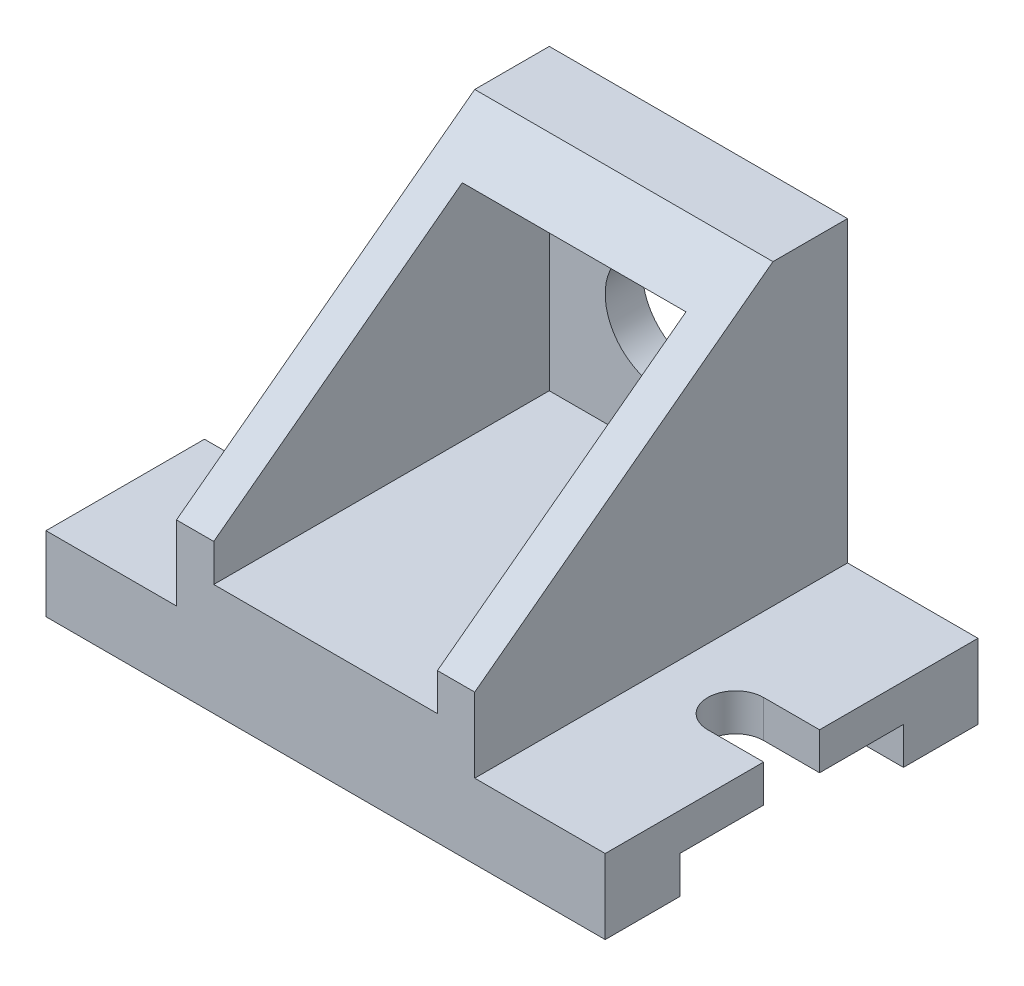
ISO-10303-21;
HEADER;
FILE_DESCRIPTION(('STEP AP214'),'2;1');
FILE_NAME('part.step','',(''),(''),'','','');
FILE_SCHEMA(('AUTOMOTIVE_DESIGN { 1 0 10303 214 1 1 1 1 }'));
ENDSEC;
DATA;
#1=APPLICATION_CONTEXT('core data for automotive mechanical design processes');
#2=APPLICATION_PROTOCOL_DEFINITION('international standard','automotive_design',2000,#1);
#3=PRODUCT_CONTEXT('',#1,'mechanical');
#4=PRODUCT('Part','Part','',(#3));
#5=PRODUCT_RELATED_PRODUCT_CATEGORY('part','',(#4));
#6=PRODUCT_DEFINITION_FORMATION('','',#4);
#7=PRODUCT_DEFINITION_CONTEXT('part definition',#1,'design');
#8=PRODUCT_DEFINITION('design','',#6,#7);
#9=PRODUCT_DEFINITION_SHAPE('','',#8);
#10=(LENGTH_UNIT() NAMED_UNIT(*) SI_UNIT(.MILLI.,.METRE.));
#11=(NAMED_UNIT(*) PLANE_ANGLE_UNIT() SI_UNIT($,.RADIAN.));
#12=(NAMED_UNIT(*) SI_UNIT($,.STERADIAN.) SOLID_ANGLE_UNIT());
#13=UNCERTAINTY_MEASURE_WITH_UNIT(LENGTH_MEASURE(1.E-05),#10,'distance_accuracy_value','');
#14=(GEOMETRIC_REPRESENTATION_CONTEXT(3) GLOBAL_UNCERTAINTY_ASSIGNED_CONTEXT((#13)) GLOBAL_UNIT_ASSIGNED_CONTEXT((#10,
#11,#12)) REPRESENTATION_CONTEXT('',''));
#15=CARTESIAN_POINT('',(0.,0.,0.));
#16=DIRECTION('',(0.,0.,1.));
#17=DIRECTION('',(1.,0.,0.));
#18=AXIS2_PLACEMENT_3D('',#15,#16,#17);
#19=CARTESIAN_POINT('',(150.,0.,0.));
#20=DIRECTION('',(1.,0.,0.));
#21=DIRECTION('',(0.,0.,-1.));
#22=AXIS2_PLACEMENT_3D('',#19,#20,#21);
#23=PLANE('',#22);
#24=DIRECTION('',(0.,1.,0.));
#25=VECTOR('',#24,1.);
#26=CARTESIAN_POINT('',(150.,0.,-7.49999999999997));
#27=LINE('',#26,#25);
#28=CARTESIAN_POINT('',(150.,0.,-7.49999999999997));
#29=VERTEX_POINT('',#28);
#30=CARTESIAN_POINT('',(150.,10.,-7.49999999999997));
#31=VERTEX_POINT('',#30);
#32=EDGE_CURVE('E41',#29,#31,#27,.T.);
#33=ORIENTED_EDGE('',*,*,#32,.F.);
#34=DIRECTION('',(0.,0.,-1.));
#35=VECTOR('',#34,1.);
#36=CARTESIAN_POINT('',(150.,0.,30.));
#37=LINE('',#36,#35);
#38=CARTESIAN_POINT('',(150.,0.,-30.));
#39=VERTEX_POINT('',#38);
#40=EDGE_CURVE('E331',#29,#39,#37,.T.);
#41=ORIENTED_EDGE('',*,*,#40,.T.);
#42=DIRECTION('',(0.,-1.,0.));
#43=VECTOR('',#42,1.);
#44=CARTESIAN_POINT('',(150.,-10.,-30.));
#45=LINE('',#44,#43);
#46=CARTESIAN_POINT('',(150.,-10.,-30.));
#47=VERTEX_POINT('',#46);
#48=EDGE_CURVE('E335',#39,#47,#45,.T.);
#49=ORIENTED_EDGE('',*,*,#48,.T.);
#50=DIRECTION('',(0.,0.,-1.));
#51=VECTOR('',#50,1.);
#52=CARTESIAN_POINT('',(150.,-9.99999999999999,-50.));
#53=LINE('',#52,#51);
#54=CARTESIAN_POINT('',(150.,-9.99999999999999,-50.));
#55=VERTEX_POINT('',#54);
#56=EDGE_CURVE('E337',#47,#55,#53,.T.);
#57=ORIENTED_EDGE('',*,*,#56,.T.);
#58=DIRECTION('',(0.,1.,0.));
#59=VECTOR('',#58,1.);
#60=CARTESIAN_POINT('',(150.,-9.99999999999999,-50.));
#61=LINE('',#60,#59);
#62=CARTESIAN_POINT('',(150.,9.99999999999999,-50.));
#63=VERTEX_POINT('',#62);
#64=EDGE_CURVE('E339',#55,#63,#61,.T.);
#65=ORIENTED_EDGE('',*,*,#64,.T.);
#66=DIRECTION('',(0.,0.,1.));
#67=VECTOR('',#66,1.);
#68=CARTESIAN_POINT('',(150.,9.99999999999999,-50.));
#69=LINE('',#68,#67);
#70=EDGE_CURVE('E342',#63,#31,#69,.T.);
#71=ORIENTED_EDGE('',*,*,#70,.T.);
#72=EDGE_LOOP('',(#33,#41,#49,#57,#65,#71));
#73=FACE_BOUND('',#72,.T.);
#74=ADVANCED_FACE('F33',(#73),#23,.T.);
#75=CARTESIAN_POINT('',(0.,0.,0.));
#76=DIRECTION('',(1.,0.,0.));
#77=DIRECTION('',(0.,0.,-1.));
#78=AXIS2_PLACEMENT_3D('',#75,#76,#77);
#79=PLANE('',#78);
#80=DIRECTION('',(0.,0.,1.));
#81=VECTOR('',#80,1.);
#82=CARTESIAN_POINT('',(0.,9.99999999999999,-50.));
#83=LINE('',#82,#81);
#84=CARTESIAN_POINT('',(0.,10.,7.5));
#85=VERTEX_POINT('',#84);
#86=CARTESIAN_POINT('',(0.,10.,50.));
#87=VERTEX_POINT('',#86);
#88=EDGE_CURVE('E363',#85,#87,#83,.T.);
#89=ORIENTED_EDGE('',*,*,#88,.F.);
#90=DIRECTION('',(0.,-1.,0.));
#91=VECTOR('',#90,1.);
#92=CARTESIAN_POINT('',(0.,0.,7.5));
#93=LINE('',#92,#91);
#94=CARTESIAN_POINT('',(0.,0.,7.5));
#95=VERTEX_POINT('',#94);
#96=EDGE_CURVE('E401',#85,#95,#93,.T.);
#97=ORIENTED_EDGE('',*,*,#96,.T.);
#98=DIRECTION('',(0.,0.,-1.));
#99=VECTOR('',#98,1.);
#100=CARTESIAN_POINT('',(0.,0.,30.));
#101=LINE('',#100,#99);
#102=CARTESIAN_POINT('',(0.,0.,30.));
#103=VERTEX_POINT('',#102);
#104=EDGE_CURVE('E353',#103,#95,#101,.T.);
#105=ORIENTED_EDGE('',*,*,#104,.F.);
#106=DIRECTION('',(0.,1.,0.));
#107=VECTOR('',#106,1.);
#108=CARTESIAN_POINT('',(0.,-10.,30.));
#109=LINE('',#108,#107);
#110=CARTESIAN_POINT('',(0.,-10.,30.));
#111=VERTEX_POINT('',#110);
#112=EDGE_CURVE('E350',#111,#103,#109,.T.);
#113=ORIENTED_EDGE('',*,*,#112,.F.);
#114=DIRECTION('',(0.,0.,-1.));
#115=VECTOR('',#114,1.);
#116=CARTESIAN_POINT('',(0.,-10.,30.));
#117=LINE('',#116,#115);
#118=CARTESIAN_POINT('',(0.,-10.,50.));
#119=VERTEX_POINT('',#118);
#120=EDGE_CURVE('E348',#119,#111,#117,.T.);
#121=ORIENTED_EDGE('',*,*,#120,.F.);
#122=DIRECTION('',(0.,-1.,0.));
#123=VECTOR('',#122,1.);
#124=CARTESIAN_POINT('',(0.,-10.,50.));
#125=LINE('',#124,#123);
#126=EDGE_CURVE('E318',#87,#119,#125,.T.);
#127=ORIENTED_EDGE('',*,*,#126,.F.);
#128=EDGE_LOOP('',(#89,#97,#105,#113,#121,#127));
#129=FACE_BOUND('',#128,.T.);
#130=ADVANCED_FACE('F451',(#129),#79,.F.);
#131=CARTESIAN_POINT('',(150.,9.99999999999999,-50.));
#132=DIRECTION('',(0.,-1.,0.));
#133=DIRECTION('',(0.,0.,-1.));
#134=AXIS2_PLACEMENT_3D('',#131,#132,#133);
#135=PLANE('',#134);
#136=CARTESIAN_POINT('',(15.,10.,0.));
#137=DIRECTION('',(0.,1.,0.));
#138=DIRECTION('',(0.,0.,1.));
#139=AXIS2_PLACEMENT_3D('',#136,#137,#138);
#140=CIRCLE('',#139,7.5);
#141=CARTESIAN_POINT('',(15.,10.,7.5));
#142=VERTEX_POINT('',#141);
#143=CARTESIAN_POINT('',(15.,10.,-7.5));
#144=VERTEX_POINT('',#143);
#145=EDGE_CURVE('E214',#142,#144,#140,.T.);
#146=ORIENTED_EDGE('',*,*,#145,.F.);
#147=DIRECTION('',(1.,0.,0.));
#148=VECTOR('',#147,1.);
#149=CARTESIAN_POINT('',(15.,10.,7.5));
#150=LINE('',#149,#148);
#151=EDGE_CURVE('E211',#85,#142,#150,.T.);
#152=ORIENTED_EDGE('',*,*,#151,.F.);
#153=ORIENTED_EDGE('',*,*,#88,.T.);
#154=DIRECTION('',(-1.,0.,0.));
#155=VECTOR('',#154,1.);
#156=CARTESIAN_POINT('',(150.,10.,50.));
#157=LINE('',#156,#155);
#158=CARTESIAN_POINT('',(35.,10.,50.));
#159=VERTEX_POINT('',#158);
#160=EDGE_CURVE('E345',#159,#87,#157,.T.);
#161=ORIENTED_EDGE('',*,*,#160,.F.);
#162=DIRECTION('',(0.,0.,1.));
#163=VECTOR('',#162,1.);
#164=CARTESIAN_POINT('',(35.,9.99999999999999,-50.));
#165=LINE('',#164,#163);
#166=CARTESIAN_POINT('',(35.,9.99999999999999,-50.));
#167=VERTEX_POINT('',#166);
#168=EDGE_CURVE('E281',#167,#159,#165,.T.);
#169=ORIENTED_EDGE('',*,*,#168,.F.);
#170=DIRECTION('',(-1.,0.,0.));
#171=VECTOR('',#170,1.);
#172=CARTESIAN_POINT('',(150.,9.99999999999999,-50.));
#173=LINE('',#172,#171);
#174=CARTESIAN_POINT('',(0.,9.99999999999999,-50.));
#175=VERTEX_POINT('',#174);
#176=EDGE_CURVE('E368',#167,#175,#173,.T.);
#177=ORIENTED_EDGE('',*,*,#176,.T.);
#178=CARTESIAN_POINT('',(0.,10.,-7.5));
#179=VERTEX_POINT('',#178);
#180=EDGE_CURVE('E225',#175,#179,#83,.T.);
#181=ORIENTED_EDGE('',*,*,#180,.T.);
#182=DIRECTION('',(-1.,0.,0.));
#183=VECTOR('',#182,1.);
#184=CARTESIAN_POINT('',(15.,10.,-7.5));
#185=LINE('',#184,#183);
#186=EDGE_CURVE('E56',#144,#179,#185,.T.);
#187=ORIENTED_EDGE('',*,*,#186,.F.);
#188=EDGE_LOOP('',(#146,#152,#153,#161,#169,#177,#181,#187));
#189=FACE_BOUND('',#188,.T.);
#190=ADVANCED_FACE('F223',(#189),#135,.F.);
#191=CARTESIAN_POINT('',(150.,-10.,50.));
#192=DIRECTION('',(0.,0.,-1.));
#193=DIRECTION('',(-1.,0.,0.));
#194=AXIS2_PLACEMENT_3D('',#191,#192,#193);
#195=PLANE('',#194);
#196=DIRECTION('',(-1.,0.,0.));
#197=VECTOR('',#196,1.);
#198=CARTESIAN_POINT('',(105.,20.,50.));
#199=LINE('',#198,#197);
#200=CARTESIAN_POINT('',(105.,20.,50.));
#201=VERTEX_POINT('',#200);
#202=CARTESIAN_POINT('',(45.,20.,50.));
#203=VERTEX_POINT('',#202);
#204=EDGE_CURVE('E264',#201,#203,#199,.T.);
#205=ORIENTED_EDGE('',*,*,#204,.T.);
#206=DIRECTION('',(0.,1.,0.));
#207=VECTOR('',#206,1.);
#208=CARTESIAN_POINT('',(45.,20.,50.));
#209=LINE('',#208,#207);
#210=CARTESIAN_POINT('',(45.,30.,50.));
#211=VERTEX_POINT('',#210);
#212=EDGE_CURVE('E257',#203,#211,#209,.T.);
#213=ORIENTED_EDGE('',*,*,#212,.T.);
#214=DIRECTION('',(-1.,0.,0.));
#215=VECTOR('',#214,1.);
#216=CARTESIAN_POINT('',(115.,30.,50.));
#217=LINE('',#216,#215);
#218=CARTESIAN_POINT('',(35.,30.,50.));
#219=VERTEX_POINT('',#218);
#220=EDGE_CURVE('E303',#211,#219,#217,.T.);
#221=ORIENTED_EDGE('',*,*,#220,.T.);
#222=DIRECTION('',(0.,1.,0.));
#223=VECTOR('',#222,1.);
#224=CARTESIAN_POINT('',(35.,10.,50.));
#225=LINE('',#224,#223);
#226=EDGE_CURVE('E306',#159,#219,#225,.T.);
#227=ORIENTED_EDGE('',*,*,#226,.F.);
#228=ORIENTED_EDGE('',*,*,#160,.T.);
#229=ORIENTED_EDGE('',*,*,#126,.T.);
#230=DIRECTION('',(-1.,0.,0.));
#231=VECTOR('',#230,1.);
#232=CARTESIAN_POINT('',(150.,-10.,50.));
#233=LINE('',#232,#231);
#234=CARTESIAN_POINT('',(150.,-10.,50.));
#235=VERTEX_POINT('',#234);
#236=EDGE_CURVE('E387',#235,#119,#233,.T.);
#237=ORIENTED_EDGE('',*,*,#236,.F.);
#238=DIRECTION('',(0.,-1.,0.));
#239=VECTOR('',#238,1.);
#240=CARTESIAN_POINT('',(150.,-10.,50.));
#241=LINE('',#240,#239);
#242=CARTESIAN_POINT('',(150.,10.,50.));
#243=VERTEX_POINT('',#242);
#244=EDGE_CURVE('E324',#243,#235,#241,.T.);
#245=ORIENTED_EDGE('',*,*,#244,.F.);
#246=CARTESIAN_POINT('',(115.,10.,50.));
#247=VERTEX_POINT('',#246);
#248=EDGE_CURVE('E365',#243,#247,#157,.T.);
#249=ORIENTED_EDGE('',*,*,#248,.T.);
#250=DIRECTION('',(0.,1.,0.));
#251=VECTOR('',#250,1.);
#252=CARTESIAN_POINT('',(115.,10.,50.));
#253=LINE('',#252,#251);
#254=CARTESIAN_POINT('',(115.,30.,50.));
#255=VERTEX_POINT('',#254);
#256=EDGE_CURVE('E290',#247,#255,#253,.T.);
#257=ORIENTED_EDGE('',*,*,#256,.T.);
#258=CARTESIAN_POINT('',(105.,30.,50.));
#259=VERTEX_POINT('',#258);
#260=EDGE_CURVE('E321',#255,#259,#217,.T.);
#261=ORIENTED_EDGE('',*,*,#260,.T.);
#262=DIRECTION('',(0.,-1.,0.));
#263=VECTOR('',#262,1.);
#264=CARTESIAN_POINT('',(105.,20.,50.));
#265=LINE('',#264,#263);
#266=EDGE_CURVE('E260',#259,#201,#265,.T.);
#267=ORIENTED_EDGE('',*,*,#266,.T.);
#268=EDGE_LOOP('',(#205,#213,#221,#227,#228,#229,#237,#245,#249,#257,#261,#267));
#269=FACE_BOUND('',#268,.T.);
#270=ADVANCED_FACE('F35',(#269),#195,.F.);
#271=CARTESIAN_POINT('',(150.,-10.,30.));
#272=DIRECTION('',(0.,1.,0.));
#273=DIRECTION('',(0.,0.,1.));
#274=AXIS2_PLACEMENT_3D('',#271,#272,#273);
#275=PLANE('',#274);
#276=ORIENTED_EDGE('',*,*,#120,.T.);
#277=DIRECTION('',(-1.,0.,0.));
#278=VECTOR('',#277,1.);
#279=CARTESIAN_POINT('',(150.,-10.,30.));
#280=LINE('',#279,#278);
#281=CARTESIAN_POINT('',(150.,-10.,30.));
#282=VERTEX_POINT('',#281);
#283=EDGE_CURVE('E384',#282,#111,#280,.T.);
#284=ORIENTED_EDGE('',*,*,#283,.F.);
#285=DIRECTION('',(0.,0.,-1.));
#286=VECTOR('',#285,1.);
#287=CARTESIAN_POINT('',(150.,-10.,30.));
#288=LINE('',#287,#286);
#289=EDGE_CURVE('E327',#235,#282,#288,.T.);
#290=ORIENTED_EDGE('',*,*,#289,.F.);
#291=ORIENTED_EDGE('',*,*,#236,.T.);
#292=EDGE_LOOP('',(#276,#284,#290,#291));
#293=FACE_BOUND('',#292,.T.);
#294=ADVANCED_FACE('F478',(#293),#275,.F.);
#295=CARTESIAN_POINT('',(150.,-10.,30.));
#296=DIRECTION('',(0.,0.,1.));
#297=DIRECTION('',(1.,0.,0.));
#298=AXIS2_PLACEMENT_3D('',#295,#296,#297);
#299=PLANE('',#298);
#300=ORIENTED_EDGE('',*,*,#112,.T.);
#301=DIRECTION('',(-1.,0.,0.));
#302=VECTOR('',#301,1.);
#303=CARTESIAN_POINT('',(150.,0.,30.));
#304=LINE('',#303,#302);
#305=CARTESIAN_POINT('',(150.,0.,30.));
#306=VERTEX_POINT('',#305);
#307=EDGE_CURVE('E381',#306,#103,#304,.T.);
#308=ORIENTED_EDGE('',*,*,#307,.F.);
#309=DIRECTION('',(0.,1.,0.));
#310=VECTOR('',#309,1.);
#311=CARTESIAN_POINT('',(150.,-10.,30.));
#312=LINE('',#311,#310);
#313=EDGE_CURVE('E329',#282,#306,#312,.T.);
#314=ORIENTED_EDGE('',*,*,#313,.F.);
#315=ORIENTED_EDGE('',*,*,#283,.T.);
#316=EDGE_LOOP('',(#300,#308,#314,#315));
#317=FACE_BOUND('',#316,.T.);
#318=ADVANCED_FACE('F482',(#317),#299,.F.);
#319=CARTESIAN_POINT('',(150.,0.,30.));
#320=DIRECTION('',(0.,1.,0.));
#321=DIRECTION('',(0.,0.,1.));
#322=AXIS2_PLACEMENT_3D('',#319,#320,#321);
#323=PLANE('',#322);
#324=ORIENTED_EDGE('',*,*,#104,.T.);
#325=DIRECTION('',(1.,0.,0.));
#326=VECTOR('',#325,1.);
#327=CARTESIAN_POINT('',(150.,0.,7.5));
#328=LINE('',#327,#326);
#329=CARTESIAN_POINT('',(15.,0.,7.5));
#330=VERTEX_POINT('',#329);
#331=EDGE_CURVE('E241',#95,#330,#328,.T.);
#332=ORIENTED_EDGE('',*,*,#331,.T.);
#333=CARTESIAN_POINT('',(15.,0.,0.));
#334=DIRECTION('',(0.,1.,0.));
#335=DIRECTION('',(0.,0.,1.));
#336=AXIS2_PLACEMENT_3D('',#333,#334,#335);
#337=CIRCLE('',#336,7.5);
#338=CARTESIAN_POINT('',(15.,0.,-7.5));
#339=VERTEX_POINT('',#338);
#340=EDGE_CURVE('E11',#330,#339,#337,.T.);
#341=ORIENTED_EDGE('',*,*,#340,.T.);
#342=DIRECTION('',(-1.,0.,0.));
#343=VECTOR('',#342,1.);
#344=CARTESIAN_POINT('',(150.,0.,-7.5));
#345=LINE('',#344,#343);
#346=CARTESIAN_POINT('',(0.,0.,-7.5));
#347=VERTEX_POINT('',#346);
#348=EDGE_CURVE('E208',#339,#347,#345,.T.);
#349=ORIENTED_EDGE('',*,*,#348,.T.);
#350=CARTESIAN_POINT('',(0.,0.,-30.));
#351=VERTEX_POINT('',#350);
#352=EDGE_CURVE('E352',#347,#351,#101,.T.);
#353=ORIENTED_EDGE('',*,*,#352,.T.);
#354=DIRECTION('',(-1.,0.,0.));
#355=VECTOR('',#354,1.);
#356=CARTESIAN_POINT('',(150.,0.,-30.));
#357=LINE('',#356,#355);
#358=EDGE_CURVE('E378',#39,#351,#357,.T.);
#359=ORIENTED_EDGE('',*,*,#358,.F.);
#360=ORIENTED_EDGE('',*,*,#40,.F.);
#361=DIRECTION('',(-1.,0.,0.));
#362=VECTOR('',#361,1.);
#363=CARTESIAN_POINT('',(150.,0.,-7.49999999999997));
#364=LINE('',#363,#362);
#365=CARTESIAN_POINT('',(135.,0.,-7.49999999999997));
#366=VERTEX_POINT('',#365);
#367=EDGE_CURVE('E247',#29,#366,#364,.T.);
#368=ORIENTED_EDGE('',*,*,#367,.T.);
#369=CARTESIAN_POINT('',(135.,0.,0.));
#370=DIRECTION('',(0.,1.,0.));
#371=DIRECTION('',(0.,0.,1.));
#372=AXIS2_PLACEMENT_3D('',#369,#370,#371);
#373=CIRCLE('',#372,7.5);
#374=CARTESIAN_POINT('',(135.,0.,7.50000000000003));
#375=VERTEX_POINT('',#374);
#376=EDGE_CURVE('E250',#366,#375,#373,.T.);
#377=ORIENTED_EDGE('',*,*,#376,.T.);
#378=DIRECTION('',(1.,0.,0.));
#379=VECTOR('',#378,1.);
#380=CARTESIAN_POINT('',(150.,0.,7.50000000000003));
#381=LINE('',#380,#379);
#382=CARTESIAN_POINT('',(150.,0.,7.50000000000003));
#383=VERTEX_POINT('',#382);
#384=EDGE_CURVE('E244',#375,#383,#381,.T.);
#385=ORIENTED_EDGE('',*,*,#384,.T.);
#386=EDGE_CURVE('E332',#306,#383,#37,.T.);
#387=ORIENTED_EDGE('',*,*,#386,.F.);
#388=ORIENTED_EDGE('',*,*,#307,.T.);
#389=EDGE_LOOP('',(#324,#332,#341,#349,#353,#359,#360,#368,#377,#385,#387,#388));
#390=FACE_BOUND('',#389,.T.);
#391=ADVANCED_FACE('F436',(#390),#323,.F.);
#392=CARTESIAN_POINT('',(150.,-10.,-30.));
#393=DIRECTION('',(0.,0.,-1.));
#394=DIRECTION('',(0.,1.,0.));
#395=AXIS2_PLACEMENT_3D('',#392,#393,#394);
#396=PLANE('',#395);
#397=DIRECTION('',(0.,-1.,0.));
#398=VECTOR('',#397,1.);
#399=CARTESIAN_POINT('',(0.,-10.,-30.));
#400=LINE('',#399,#398);
#401=CARTESIAN_POINT('',(0.,-10.,-30.));
#402=VERTEX_POINT('',#401);
#403=EDGE_CURVE('E356',#351,#402,#400,.T.);
#404=ORIENTED_EDGE('',*,*,#403,.T.);
#405=DIRECTION('',(-1.,0.,0.));
#406=VECTOR('',#405,1.);
#407=CARTESIAN_POINT('',(150.,-10.,-30.));
#408=LINE('',#407,#406);
#409=EDGE_CURVE('E375',#47,#402,#408,.T.);
#410=ORIENTED_EDGE('',*,*,#409,.F.);
#411=ORIENTED_EDGE('',*,*,#48,.F.);
#412=ORIENTED_EDGE('',*,*,#358,.T.);
#413=EDGE_LOOP('',(#404,#410,#411,#412));
#414=FACE_BOUND('',#413,.T.);
#415=ADVANCED_FACE('F492',(#414),#396,.F.);
#416=CARTESIAN_POINT('',(150.,-9.99999999999999,-50.));
#417=DIRECTION('',(0.,1.,0.));
#418=DIRECTION('',(0.,0.,1.));
#419=AXIS2_PLACEMENT_3D('',#416,#417,#418);
#420=PLANE('',#419);
#421=DIRECTION('',(0.,0.,-1.));
#422=VECTOR('',#421,1.);
#423=CARTESIAN_POINT('',(0.,-9.99999999999999,-50.));
#424=LINE('',#423,#422);
#425=CARTESIAN_POINT('',(0.,-9.99999999999999,-50.));
#426=VERTEX_POINT('',#425);
#427=EDGE_CURVE('E358',#402,#426,#424,.T.);
#428=ORIENTED_EDGE('',*,*,#427,.T.);
#429=DIRECTION('',(-1.,0.,0.));
#430=VECTOR('',#429,1.);
#431=CARTESIAN_POINT('',(150.,-9.99999999999999,-50.));
#432=LINE('',#431,#430);
#433=EDGE_CURVE('E372',#55,#426,#432,.T.);
#434=ORIENTED_EDGE('',*,*,#433,.F.);
#435=ORIENTED_EDGE('',*,*,#56,.F.);
#436=ORIENTED_EDGE('',*,*,#409,.T.);
#437=EDGE_LOOP('',(#428,#434,#435,#436));
#438=FACE_BOUND('',#437,.T.);
#439=ADVANCED_FACE('F471',(#438),#420,.F.);
#440=CARTESIAN_POINT('',(150.,-9.99999999999999,-50.));
#441=DIRECTION('',(0.,0.,1.));
#442=DIRECTION('',(1.,0.,0.));
#443=AXIS2_PLACEMENT_3D('',#440,#441,#442);
#444=PLANE('',#443);
#445=CARTESIAN_POINT('',(75.,50.,-50.));
#446=DIRECTION('',(0.,0.,1.));
#447=DIRECTION('',(1.,0.,0.));
#448=AXIS2_PLACEMENT_3D('',#445,#446,#447);
#449=CIRCLE('',#448,15.);
#450=CARTESIAN_POINT('',(90.,50.,-50.));
#451=VERTEX_POINT('',#450);
#452=EDGE_CURVE('E256',#451,#451,#449,.T.);
#453=ORIENTED_EDGE('',*,*,#452,.T.);
#454=EDGE_LOOP('',(#453));
#455=FACE_BOUND('',#454,.T.);
#456=DIRECTION('',(0.,1.,0.));
#457=VECTOR('',#456,1.);
#458=CARTESIAN_POINT('',(0.,-9.99999999999999,-50.));
#459=LINE('',#458,#457);
#460=EDGE_CURVE('E360',#426,#175,#459,.T.);
#461=ORIENTED_EDGE('',*,*,#460,.T.);
#462=ORIENTED_EDGE('',*,*,#176,.F.);
#463=DIRECTION('',(0.,-1.,0.));
#464=VECTOR('',#463,1.);
#465=CARTESIAN_POINT('',(35.,90.,-50.));
#466=LINE('',#465,#464);
#467=CARTESIAN_POINT('',(35.,90.,-50.));
#468=VERTEX_POINT('',#467);
#469=EDGE_CURVE('E291',#468,#167,#466,.T.);
#470=ORIENTED_EDGE('',*,*,#469,.F.);
#471=DIRECTION('',(-1.,0.,0.));
#472=VECTOR('',#471,1.);
#473=CARTESIAN_POINT('',(115.,90.,-50.));
#474=LINE('',#473,#472);
#475=CARTESIAN_POINT('',(115.,90.,-50.));
#476=VERTEX_POINT('',#475);
#477=EDGE_CURVE('E316',#476,#468,#474,.T.);
#478=ORIENTED_EDGE('',*,*,#477,.F.);
#479=DIRECTION('',(0.,-1.,0.));
#480=VECTOR('',#479,1.);
#481=CARTESIAN_POINT('',(115.,90.,-50.));
#482=LINE('',#481,#480);
#483=CARTESIAN_POINT('',(115.,9.99999999999999,-50.));
#484=VERTEX_POINT('',#483);
#485=EDGE_CURVE('E300',#476,#484,#482,.T.);
#486=ORIENTED_EDGE('',*,*,#485,.T.);
#487=EDGE_CURVE('E369',#63,#484,#173,.T.);
#488=ORIENTED_EDGE('',*,*,#487,.F.);
#489=ORIENTED_EDGE('',*,*,#64,.F.);
#490=ORIENTED_EDGE('',*,*,#433,.T.);
#491=EDGE_LOOP('',(#461,#462,#470,#478,#486,#488,#489,#490));
#492=FACE_BOUND('',#491,.T.);
#493=ADVANCED_FACE('F421',(#455,#492),#444,.F.);
#494=CARTESIAN_POINT('',(135.,10.,0.));
#495=DIRECTION('',(0.,1.,0.));
#496=DIRECTION('',(0.,0.,-1.));
#497=AXIS2_PLACEMENT_3D('',#494,#495,#496);
#498=CIRCLE('',#497,7.5);
#499=CARTESIAN_POINT('',(135.,10.,-7.49999999999997));
#500=VERTEX_POINT('',#499);
#501=CARTESIAN_POINT('',(135.,10.,7.50000000000003));
#502=VERTEX_POINT('',#501);
#503=EDGE_CURVE('E230',#500,#502,#498,.T.);
#504=ORIENTED_EDGE('',*,*,#503,.F.);
#505=DIRECTION('',(-1.,0.,0.));
#506=VECTOR('',#505,1.);
#507=CARTESIAN_POINT('',(135.,10.,-7.49999999999997));
#508=LINE('',#507,#506);
#509=EDGE_CURVE('E234',#31,#500,#508,.T.);
#510=ORIENTED_EDGE('',*,*,#509,.F.);
#511=ORIENTED_EDGE('',*,*,#70,.F.);
#512=ORIENTED_EDGE('',*,*,#487,.T.);
#513=DIRECTION('',(0.,0.,1.));
#514=VECTOR('',#513,1.);
#515=CARTESIAN_POINT('',(115.,9.99999999999999,-50.));
#516=LINE('',#515,#514);
#517=EDGE_CURVE('E287',#484,#247,#516,.T.);
#518=ORIENTED_EDGE('',*,*,#517,.T.);
#519=ORIENTED_EDGE('',*,*,#248,.F.);
#520=CARTESIAN_POINT('',(150.,10.,7.50000000000003));
#521=VERTEX_POINT('',#520);
#522=EDGE_CURVE('E341',#521,#243,#69,.T.);
#523=ORIENTED_EDGE('',*,*,#522,.F.);
#524=DIRECTION('',(1.,0.,0.));
#525=VECTOR('',#524,1.);
#526=CARTESIAN_POINT('',(135.,10.,7.50000000000003));
#527=LINE('',#526,#525);
#528=EDGE_CURVE('E48',#502,#521,#527,.T.);
#529=ORIENTED_EDGE('',*,*,#528,.F.);
#530=EDGE_LOOP('',(#504,#510,#511,#512,#518,#519,#523,#529));
#531=FACE_BOUND('',#530,.T.);
#532=ADVANCED_FACE('F415',(#531),#135,.F.);
#533=DIRECTION('',(0.,-1.,0.));
#534=VECTOR('',#533,1.);
#535=CARTESIAN_POINT('',(150.,0.,7.50000000000003));
#536=LINE('',#535,#534);
#537=EDGE_CURVE('E404',#521,#383,#536,.T.);
#538=ORIENTED_EDGE('',*,*,#537,.F.);
#539=ORIENTED_EDGE('',*,*,#522,.T.);
#540=ORIENTED_EDGE('',*,*,#244,.T.);
#541=ORIENTED_EDGE('',*,*,#289,.T.);
#542=ORIENTED_EDGE('',*,*,#313,.T.);
#543=ORIENTED_EDGE('',*,*,#386,.T.);
#544=EDGE_LOOP('',(#538,#539,#540,#541,#542,#543));
#545=FACE_BOUND('',#544,.T.);
#546=ADVANCED_FACE('F430',(#545),#23,.T.);
#547=ORIENTED_EDGE('',*,*,#352,.F.);
#548=DIRECTION('',(0.,1.,0.));
#549=VECTOR('',#548,1.);
#550=CARTESIAN_POINT('',(0.,0.,-7.5));
#551=LINE('',#550,#549);
#552=EDGE_CURVE('E397',#347,#179,#551,.T.);
#553=ORIENTED_EDGE('',*,*,#552,.T.);
#554=ORIENTED_EDGE('',*,*,#180,.F.);
#555=ORIENTED_EDGE('',*,*,#460,.F.);
#556=ORIENTED_EDGE('',*,*,#427,.F.);
#557=ORIENTED_EDGE('',*,*,#403,.F.);
#558=EDGE_LOOP('',(#547,#553,#554,#555,#556,#557));
#559=FACE_BOUND('',#558,.T.);
#560=ADVANCED_FACE('F458',(#559),#79,.F.);
#561=CARTESIAN_POINT('',(115.,90.,-30.));
#562=DIRECTION('',(0.,1.,0.));
#563=DIRECTION('',(0.,0.,1.));
#564=AXIS2_PLACEMENT_3D('',#561,#562,#563);
#565=PLANE('',#564);
#566=DIRECTION('',(0.,0.,-1.));
#567=VECTOR('',#566,1.);
#568=CARTESIAN_POINT('',(35.,90.,-30.));
#569=LINE('',#568,#567);
#570=CARTESIAN_POINT('',(35.,90.,-30.));
#571=VERTEX_POINT('',#570);
#572=EDGE_CURVE('E312',#571,#468,#569,.T.);
#573=ORIENTED_EDGE('',*,*,#572,.F.);
#574=DIRECTION('',(-1.,0.,0.));
#575=VECTOR('',#574,1.);
#576=CARTESIAN_POINT('',(115.,90.,-30.));
#577=LINE('',#576,#575);
#578=CARTESIAN_POINT('',(115.,90.,-30.));
#579=VERTEX_POINT('',#578);
#580=EDGE_CURVE('E319',#579,#571,#577,.T.);
#581=ORIENTED_EDGE('',*,*,#580,.F.);
#582=DIRECTION('',(0.,0.,-1.));
#583=VECTOR('',#582,1.);
#584=CARTESIAN_POINT('',(115.,90.,-30.));
#585=LINE('',#584,#583);
#586=EDGE_CURVE('E297',#579,#476,#585,.T.);
#587=ORIENTED_EDGE('',*,*,#586,.T.);
#588=ORIENTED_EDGE('',*,*,#477,.T.);
#589=EDGE_LOOP('',(#573,#581,#587,#588));
#590=FACE_BOUND('',#589,.T.);
#591=ADVANCED_FACE('F465',(#590),#565,.T.);
#592=CARTESIAN_POINT('',(115.,30.,50.));
#593=DIRECTION('',(0.,0.8,0.6));
#594=DIRECTION('',(0.,-0.6,0.8));
#595=AXIS2_PLACEMENT_3D('',#592,#593,#594);
#596=PLANE('',#595);
#597=DIRECTION('',(0.,-0.6,0.8));
#598=VECTOR('',#597,1.);
#599=CARTESIAN_POINT('',(45.,30.,50.));
#600=LINE('',#599,#598);
#601=CARTESIAN_POINT('',(45.,80.,-16.6666666666667));
#602=VERTEX_POINT('',#601);
#603=EDGE_CURVE('E395',#602,#211,#600,.T.);
#604=ORIENTED_EDGE('',*,*,#603,.F.);
#605=DIRECTION('',(-1.,0.,0.));
#606=VECTOR('',#605,1.);
#607=CARTESIAN_POINT('',(115.,80.,-16.6666666666667));
#608=LINE('',#607,#606);
#609=CARTESIAN_POINT('',(105.,80.,-16.6666666666667));
#610=VERTEX_POINT('',#609);
#611=EDGE_CURVE('E390',#610,#602,#608,.T.);
#612=ORIENTED_EDGE('',*,*,#611,.F.);
#613=DIRECTION('',(0.,0.6,-0.8));
#614=VECTOR('',#613,1.);
#615=CARTESIAN_POINT('',(105.,30.,50.));
#616=LINE('',#615,#614);
#617=EDGE_CURVE('E392',#259,#610,#616,.T.);
#618=ORIENTED_EDGE('',*,*,#617,.F.);
#619=ORIENTED_EDGE('',*,*,#260,.F.);
#620=DIRECTION('',(0.,0.6,-0.8));
#621=VECTOR('',#620,1.);
#622=CARTESIAN_POINT('',(115.,30.,50.));
#623=LINE('',#622,#621);
#624=EDGE_CURVE('E294',#255,#579,#623,.T.);
#625=ORIENTED_EDGE('',*,*,#624,.T.);
#626=ORIENTED_EDGE('',*,*,#580,.T.);
#627=DIRECTION('',(0.,0.6,-0.8));
#628=VECTOR('',#627,1.);
#629=CARTESIAN_POINT('',(35.,30.,50.));
#630=LINE('',#629,#628);
#631=EDGE_CURVE('E309',#219,#571,#630,.T.);
#632=ORIENTED_EDGE('',*,*,#631,.F.);
#633=ORIENTED_EDGE('',*,*,#220,.F.);
#634=EDGE_LOOP('',(#604,#612,#618,#619,#625,#626,#632,#633));
#635=FACE_BOUND('',#634,.T.);
#636=ADVANCED_FACE('F525',(#635),#596,.T.);
#637=CARTESIAN_POINT('',(115.,0.,0.));
#638=DIRECTION('',(-1.,0.,0.));
#639=DIRECTION('',(0.,0.,1.));
#640=AXIS2_PLACEMENT_3D('',#637,#638,#639);
#641=PLANE('',#640);
#642=ORIENTED_EDGE('',*,*,#517,.F.);
#643=ORIENTED_EDGE('',*,*,#485,.F.);
#644=ORIENTED_EDGE('',*,*,#586,.F.);
#645=ORIENTED_EDGE('',*,*,#624,.F.);
#646=ORIENTED_EDGE('',*,*,#256,.F.);
#647=EDGE_LOOP('',(#642,#643,#644,#645,#646));
#648=FACE_BOUND('',#647,.T.);
#649=ADVANCED_FACE('F523',(#648),#641,.F.);
#650=CARTESIAN_POINT('',(35.,0.,0.));
#651=DIRECTION('',(-1.,0.,0.));
#652=DIRECTION('',(0.,0.,1.));
#653=AXIS2_PLACEMENT_3D('',#650,#651,#652);
#654=PLANE('',#653);
#655=ORIENTED_EDGE('',*,*,#168,.T.);
#656=ORIENTED_EDGE('',*,*,#226,.T.);
#657=ORIENTED_EDGE('',*,*,#631,.T.);
#658=ORIENTED_EDGE('',*,*,#572,.T.);
#659=ORIENTED_EDGE('',*,*,#469,.T.);
#660=EDGE_LOOP('',(#655,#656,#657,#658,#659));
#661=FACE_BOUND('',#660,.T.);
#662=ADVANCED_FACE('F517',(#661),#654,.T.);
#663=CARTESIAN_POINT('',(45.,20.,50.));
#664=DIRECTION('',(-1.,0.,0.));
#665=DIRECTION('',(0.,0.,1.));
#666=AXIS2_PLACEMENT_3D('',#663,#664,#665);
#667=PLANE('',#666);
#668=ORIENTED_EDGE('',*,*,#603,.T.);
#669=ORIENTED_EDGE('',*,*,#212,.F.);
#670=DIRECTION('',(0.,0.,-1.));
#671=VECTOR('',#670,1.);
#672=CARTESIAN_POINT('',(45.,20.,50.));
#673=LINE('',#672,#671);
#674=CARTESIAN_POINT('',(45.,20.,-40.));
#675=VERTEX_POINT('',#674);
#676=EDGE_CURVE('E279',#203,#675,#673,.T.);
#677=ORIENTED_EDGE('',*,*,#676,.T.);
#678=DIRECTION('',(0.,1.,0.));
#679=VECTOR('',#678,1.);
#680=CARTESIAN_POINT('',(45.,20.,-40.));
#681=LINE('',#680,#679);
#682=CARTESIAN_POINT('',(45.,80.,-40.));
#683=VERTEX_POINT('',#682);
#684=EDGE_CURVE('E268',#675,#683,#681,.T.);
#685=ORIENTED_EDGE('',*,*,#684,.T.);
#686=DIRECTION('',(0.,0.,-1.));
#687=VECTOR('',#686,1.);
#688=CARTESIAN_POINT('',(45.,80.,50.));
#689=LINE('',#688,#687);
#690=EDGE_CURVE('E267',#602,#683,#689,.T.);
#691=ORIENTED_EDGE('',*,*,#690,.F.);
#692=EDGE_LOOP('',(#668,#669,#677,#685,#691));
#693=FACE_BOUND('',#692,.T.);
#694=ADVANCED_FACE('F531',(#693),#667,.F.);
#695=CARTESIAN_POINT('',(105.,20.,50.));
#696=DIRECTION('',(0.,-1.,0.));
#697=DIRECTION('',(0.,0.,-1.));
#698=AXIS2_PLACEMENT_3D('',#695,#696,#697);
#699=PLANE('',#698);
#700=DIRECTION('',(-1.,0.,0.));
#701=VECTOR('',#700,1.);
#702=CARTESIAN_POINT('',(105.,20.,-40.));
#703=LINE('',#702,#701);
#704=CARTESIAN_POINT('',(105.,20.,-40.));
#705=VERTEX_POINT('',#704);
#706=EDGE_CURVE('E261',#705,#675,#703,.T.);
#707=ORIENTED_EDGE('',*,*,#706,.T.);
#708=ORIENTED_EDGE('',*,*,#676,.F.);
#709=ORIENTED_EDGE('',*,*,#204,.F.);
#710=DIRECTION('',(0.,0.,-1.));
#711=VECTOR('',#710,1.);
#712=CARTESIAN_POINT('',(105.,20.,50.));
#713=LINE('',#712,#711);
#714=EDGE_CURVE('E282',#201,#705,#713,.T.);
#715=ORIENTED_EDGE('',*,*,#714,.T.);
#716=EDGE_LOOP('',(#707,#708,#709,#715));
#717=FACE_BOUND('',#716,.T.);
#718=ADVANCED_FACE('F559',(#717),#699,.F.);
#719=CARTESIAN_POINT('',(105.,20.,50.));
#720=DIRECTION('',(1.,0.,0.));
#721=DIRECTION('',(0.,0.,-1.));
#722=AXIS2_PLACEMENT_3D('',#719,#720,#721);
#723=PLANE('',#722);
#724=ORIENTED_EDGE('',*,*,#617,.T.);
#725=DIRECTION('',(0.,0.,-1.));
#726=VECTOR('',#725,1.);
#727=CARTESIAN_POINT('',(105.,80.,50.));
#728=LINE('',#727,#726);
#729=CARTESIAN_POINT('',(105.,80.,-40.));
#730=VERTEX_POINT('',#729);
#731=EDGE_CURVE('E284',#610,#730,#728,.T.);
#732=ORIENTED_EDGE('',*,*,#731,.T.);
#733=DIRECTION('',(0.,-1.,0.));
#734=VECTOR('',#733,1.);
#735=CARTESIAN_POINT('',(105.,20.,-40.));
#736=LINE('',#735,#734);
#737=EDGE_CURVE('E274',#730,#705,#736,.T.);
#738=ORIENTED_EDGE('',*,*,#737,.T.);
#739=ORIENTED_EDGE('',*,*,#714,.F.);
#740=ORIENTED_EDGE('',*,*,#266,.F.);
#741=EDGE_LOOP('',(#724,#732,#738,#739,#740));
#742=FACE_BOUND('',#741,.T.);
#743=ADVANCED_FACE('F569',(#742),#723,.F.);
#744=CARTESIAN_POINT('',(105.,80.,50.));
#745=DIRECTION('',(0.,1.,0.));
#746=DIRECTION('',(0.,0.,1.));
#747=AXIS2_PLACEMENT_3D('',#744,#745,#746);
#748=PLANE('',#747);
#749=ORIENTED_EDGE('',*,*,#611,.T.);
#750=ORIENTED_EDGE('',*,*,#690,.T.);
#751=DIRECTION('',(1.,0.,0.));
#752=VECTOR('',#751,1.);
#753=CARTESIAN_POINT('',(105.,80.,-40.));
#754=LINE('',#753,#752);
#755=EDGE_CURVE('E271',#683,#730,#754,.T.);
#756=ORIENTED_EDGE('',*,*,#755,.T.);
#757=ORIENTED_EDGE('',*,*,#731,.F.);
#758=EDGE_LOOP('',(#749,#750,#756,#757));
#759=FACE_BOUND('',#758,.T.);
#760=ADVANCED_FACE('F579',(#759),#748,.F.);
#761=CARTESIAN_POINT('',(0.,0.,-40.));
#762=DIRECTION('',(0.,0.,1.));
#763=DIRECTION('',(1.,0.,0.));
#764=AXIS2_PLACEMENT_3D('',#761,#762,#763);
#765=PLANE('',#764);
#766=CARTESIAN_POINT('',(75.,50.,-40.));
#767=DIRECTION('',(0.,0.,1.));
#768=DIRECTION('',(1.,0.,0.));
#769=AXIS2_PLACEMENT_3D('',#766,#767,#768);
#770=CIRCLE('',#769,15.);
#771=CARTESIAN_POINT('',(90.,50.,-40.));
#772=VERTEX_POINT('',#771);
#773=EDGE_CURVE('E253',#772,#772,#770,.T.);
#774=ORIENTED_EDGE('',*,*,#773,.F.);
#775=EDGE_LOOP('',(#774));
#776=FACE_BOUND('',#775,.T.);
#777=ORIENTED_EDGE('',*,*,#684,.F.);
#778=ORIENTED_EDGE('',*,*,#706,.F.);
#779=ORIENTED_EDGE('',*,*,#737,.F.);
#780=ORIENTED_EDGE('',*,*,#755,.F.);
#781=EDGE_LOOP('',(#777,#778,#779,#780));
#782=FACE_BOUND('',#781,.T.);
#783=ADVANCED_FACE('F589',(#776,#782),#765,.T.);
#784=CARTESIAN_POINT('',(75.,50.,-120.));
#785=DIRECTION('',(0.,0.,1.));
#786=DIRECTION('',(1.,0.,0.));
#787=AXIS2_PLACEMENT_3D('',#784,#785,#786);
#788=CYLINDRICAL_SURFACE('',#787,15.);
#789=ORIENTED_EDGE('',*,*,#773,.T.);
#790=EDGE_LOOP('',(#789));
#791=FACE_BOUND('',#790,.T.);
#792=ORIENTED_EDGE('',*,*,#452,.F.);
#793=EDGE_LOOP('',(#792));
#794=FACE_BOUND('',#793,.T.);
#795=ADVANCED_FACE('F605',(#791,#794),#788,.F.);
#796=CARTESIAN_POINT('',(15.,-10.,0.));
#797=DIRECTION('',(0.,1.,0.));
#798=DIRECTION('',(0.,0.,1.));
#799=AXIS2_PLACEMENT_3D('',#796,#797,#798);
#800=CYLINDRICAL_SURFACE('',#799,7.5);
#801=DIRECTION('',(0.,1.,0.));
#802=VECTOR('',#801,1.);
#803=CARTESIAN_POINT('',(15.,-10.,7.5));
#804=LINE('',#803,#802);
#805=EDGE_CURVE('E210',#330,#142,#804,.T.);
#806=ORIENTED_EDGE('',*,*,#805,.T.);
#807=ORIENTED_EDGE('',*,*,#145,.T.);
#808=DIRECTION('',(0.,1.,0.));
#809=VECTOR('',#808,1.);
#810=CARTESIAN_POINT('',(15.,-10.,-7.5));
#811=LINE('',#810,#809);
#812=EDGE_CURVE('E204',#339,#144,#811,.T.);
#813=ORIENTED_EDGE('',*,*,#812,.F.);
#814=ORIENTED_EDGE('',*,*,#340,.F.);
#815=EDGE_LOOP('',(#806,#807,#813,#814));
#816=FACE_BOUND('',#815,.T.);
#817=ADVANCED_FACE('F215',(#816),#800,.F.);
#818=CARTESIAN_POINT('',(15.,-10.,7.5));
#819=DIRECTION('',(0.,0.,1.));
#820=DIRECTION('',(0.,-1.,0.));
#821=AXIS2_PLACEMENT_3D('',#818,#819,#820);
#822=PLANE('',#821);
#823=ORIENTED_EDGE('',*,*,#96,.F.);
#824=ORIENTED_EDGE('',*,*,#151,.T.);
#825=ORIENTED_EDGE('',*,*,#805,.F.);
#826=ORIENTED_EDGE('',*,*,#331,.F.);
#827=EDGE_LOOP('',(#823,#824,#825,#826));
#828=FACE_BOUND('',#827,.T.);
#829=ADVANCED_FACE('F446',(#828),#822,.F.);
#830=CARTESIAN_POINT('',(15.,-10.,-7.5));
#831=DIRECTION('',(0.,0.,-1.));
#832=DIRECTION('',(0.,1.,0.));
#833=AXIS2_PLACEMENT_3D('',#830,#831,#832);
#834=PLANE('',#833);
#835=ORIENTED_EDGE('',*,*,#812,.T.);
#836=ORIENTED_EDGE('',*,*,#186,.T.);
#837=ORIENTED_EDGE('',*,*,#552,.F.);
#838=ORIENTED_EDGE('',*,*,#348,.F.);
#839=EDGE_LOOP('',(#835,#836,#837,#838));
#840=FACE_BOUND('',#839,.T.);
#841=ADVANCED_FACE('F206',(#840),#834,.F.);
#842=CARTESIAN_POINT('',(135.,-10.,0.));
#843=DIRECTION('',(0.,1.,0.));
#844=DIRECTION('',(0.,0.,1.));
#845=AXIS2_PLACEMENT_3D('',#842,#843,#844);
#846=CYLINDRICAL_SURFACE('',#845,7.5);
#847=DIRECTION('',(0.,1.,0.));
#848=VECTOR('',#847,1.);
#849=CARTESIAN_POINT('',(135.,-10.,-7.49999999999997));
#850=LINE('',#849,#848);
#851=EDGE_CURVE('E220',#366,#500,#850,.T.);
#852=ORIENTED_EDGE('',*,*,#851,.T.);
#853=ORIENTED_EDGE('',*,*,#503,.T.);
#854=DIRECTION('',(0.,1.,0.));
#855=VECTOR('',#854,1.);
#856=CARTESIAN_POINT('',(135.,-10.,7.50000000000003));
#857=LINE('',#856,#855);
#858=EDGE_CURVE('E237',#375,#502,#857,.T.);
#859=ORIENTED_EDGE('',*,*,#858,.F.);
#860=ORIENTED_EDGE('',*,*,#376,.F.);
#861=EDGE_LOOP('',(#852,#853,#859,#860));
#862=FACE_BOUND('',#861,.T.);
#863=ADVANCED_FACE('F438',(#862),#846,.F.);
#864=CARTESIAN_POINT('',(135.,-10.,-7.49999999999997));
#865=DIRECTION('',(0.,0.,-1.));
#866=DIRECTION('',(0.,1.,0.));
#867=AXIS2_PLACEMENT_3D('',#864,#865,#866);
#868=PLANE('',#867);
#869=ORIENTED_EDGE('',*,*,#32,.T.);
#870=ORIENTED_EDGE('',*,*,#509,.T.);
#871=ORIENTED_EDGE('',*,*,#851,.F.);
#872=ORIENTED_EDGE('',*,*,#367,.F.);
#873=EDGE_LOOP('',(#869,#870,#871,#872));
#874=FACE_BOUND('',#873,.T.);
#875=ADVANCED_FACE('F408',(#874),#868,.F.);
#876=CARTESIAN_POINT('',(135.,-10.,7.50000000000003));
#877=DIRECTION('',(0.,0.,1.));
#878=DIRECTION('',(0.,-1.,0.));
#879=AXIS2_PLACEMENT_3D('',#876,#877,#878);
#880=PLANE('',#879);
#881=ORIENTED_EDGE('',*,*,#858,.T.);
#882=ORIENTED_EDGE('',*,*,#528,.T.);
#883=ORIENTED_EDGE('',*,*,#537,.T.);
#884=ORIENTED_EDGE('',*,*,#384,.F.);
#885=EDGE_LOOP('',(#881,#882,#883,#884));
#886=FACE_BOUND('',#885,.T.);
#887=ADVANCED_FACE('F433',(#886),#880,.F.);
#888=CLOSED_SHELL('',(#74,#130,#190,#270,#294,#318,#391,#415,#439,#493,#532,#546,#560,#591,#636,
#649,#662,#694,#718,#743,#760,#783,#795,#817,#829,#841,#863,#875,#887));
#889=MANIFOLD_SOLID_BREP('B2',#888);
#890=ADVANCED_BREP_SHAPE_REPRESENTATION('',(#18,#889),#14);
#891=SHAPE_DEFINITION_REPRESENTATION(#9,#890);
ENDSEC;
END-ISO-10303-21;
